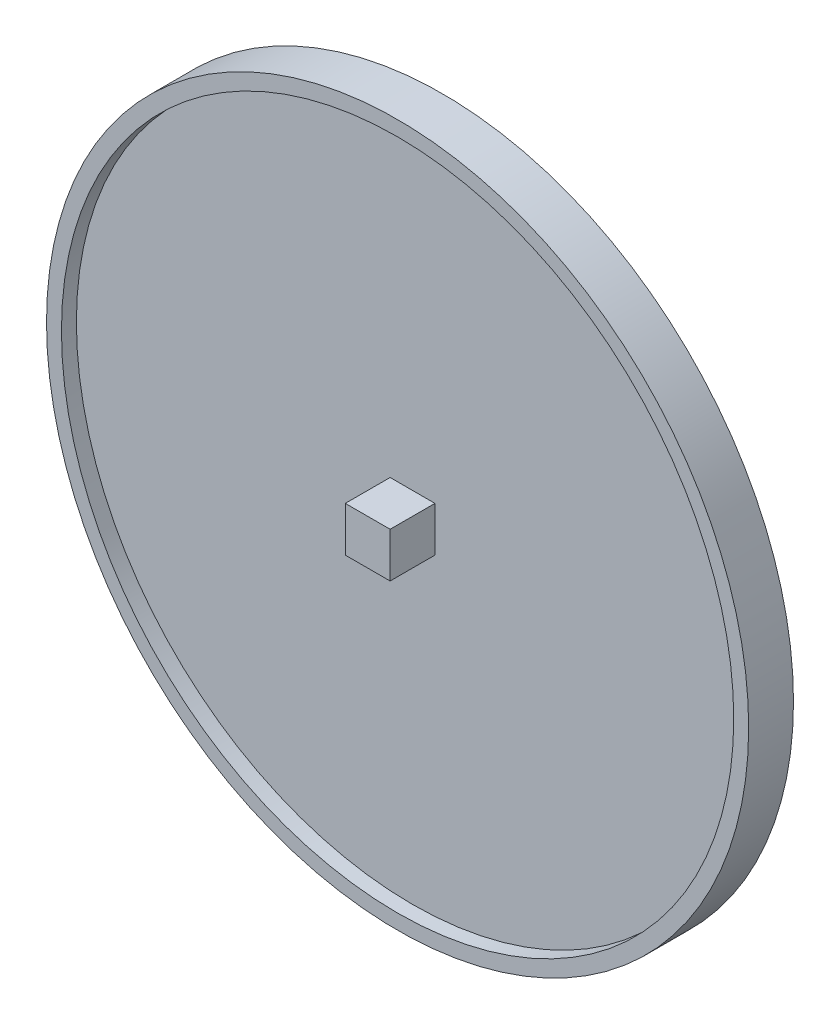
ISO-10303-21;
HEADER;
FILE_DESCRIPTION(('STEP AP214'),'2;1');
FILE_NAME('part.step','',(''),(''),'','','');
FILE_SCHEMA(('AUTOMOTIVE_DESIGN { 1 0 10303 214 1 1 1 1 }'));
ENDSEC;
DATA;
#1=APPLICATION_CONTEXT('core data for automotive mechanical design processes');
#2=APPLICATION_PROTOCOL_DEFINITION('international standard','automotive_design',2000,#1);
#3=PRODUCT_CONTEXT('',#1,'mechanical');
#4=PRODUCT('Part','Part','',(#3));
#5=PRODUCT_RELATED_PRODUCT_CATEGORY('part','',(#4));
#6=PRODUCT_DEFINITION_FORMATION('','',#4);
#7=PRODUCT_DEFINITION_CONTEXT('part definition',#1,'design');
#8=PRODUCT_DEFINITION('design','',#6,#7);
#9=PRODUCT_DEFINITION_SHAPE('','',#8);
#10=(LENGTH_UNIT() NAMED_UNIT(*) SI_UNIT(.MILLI.,.METRE.));
#11=(NAMED_UNIT(*) PLANE_ANGLE_UNIT() SI_UNIT($,.RADIAN.));
#12=(NAMED_UNIT(*) SI_UNIT($,.STERADIAN.) SOLID_ANGLE_UNIT());
#13=UNCERTAINTY_MEASURE_WITH_UNIT(LENGTH_MEASURE(1.E-05),#10,'distance_accuracy_value','');
#14=(GEOMETRIC_REPRESENTATION_CONTEXT(3) GLOBAL_UNCERTAINTY_ASSIGNED_CONTEXT((#13)) GLOBAL_UNIT_ASSIGNED_CONTEXT((#10,
#11,#12)) REPRESENTATION_CONTEXT('',''));
#15=CARTESIAN_POINT('',(0.,0.,0.));
#16=DIRECTION('',(0.,0.,1.));
#17=DIRECTION('',(1.,0.,0.));
#18=AXIS2_PLACEMENT_3D('',#15,#16,#17);
#19=CARTESIAN_POINT('',(0.,0.,20.));
#20=DIRECTION('',(0.,0.,1.));
#21=DIRECTION('',(1.,0.,0.));
#22=AXIS2_PLACEMENT_3D('',#19,#20,#21);
#23=PLANE('',#22);
#24=CARTESIAN_POINT('',(0.,0.,20.));
#25=DIRECTION('',(0.,0.,1.));
#26=DIRECTION('',(1.,0.,0.));
#27=AXIS2_PLACEMENT_3D('',#24,#25,#26);
#28=CIRCLE('',#27,225.);
#29=CARTESIAN_POINT('',(225.,0.,20.));
#30=VERTEX_POINT('',#29);
#31=EDGE_CURVE('E11',#30,#30,#28,.F.);
#32=ORIENTED_EDGE('',*,*,#31,.F.);
#33=EDGE_LOOP('',(#32));
#34=FACE_BOUND('',#33,.T.);
#35=DIRECTION('',(1.,0.,0.));
#36=VECTOR('',#35,1.);
#37=CARTESIAN_POINT('',(15.,-15.,20.));
#38=LINE('',#37,#36);
#39=CARTESIAN_POINT('',(-15.,-15.,20.));
#40=VERTEX_POINT('',#39);
#41=CARTESIAN_POINT('',(15.,-15.,20.));
#42=VERTEX_POINT('',#41);
#43=EDGE_CURVE('E97',#40,#42,#38,.T.);
#44=ORIENTED_EDGE('',*,*,#43,.F.);
#45=DIRECTION('',(0.,-1.,0.));
#46=VECTOR('',#45,1.);
#47=CARTESIAN_POINT('',(-15.,-15.,20.));
#48=LINE('',#47,#46);
#49=CARTESIAN_POINT('',(-15.,15.,20.));
#50=VERTEX_POINT('',#49);
#51=EDGE_CURVE('E111',#50,#40,#48,.T.);
#52=ORIENTED_EDGE('',*,*,#51,.F.);
#53=DIRECTION('',(-1.,0.,0.));
#54=VECTOR('',#53,1.);
#55=CARTESIAN_POINT('',(15.,15.,20.));
#56=LINE('',#55,#54);
#57=CARTESIAN_POINT('',(15.,15.,20.));
#58=VERTEX_POINT('',#57);
#59=EDGE_CURVE('E77',#58,#50,#56,.T.);
#60=ORIENTED_EDGE('',*,*,#59,.F.);
#61=DIRECTION('',(0.,1.,0.));
#62=VECTOR('',#61,1.);
#63=CARTESIAN_POINT('',(15.,-15.,20.));
#64=LINE('',#63,#62);
#65=EDGE_CURVE('E117',#42,#58,#64,.T.);
#66=ORIENTED_EDGE('',*,*,#65,.F.);
#67=EDGE_LOOP('',(#44,#52,#60,#66));
#68=FACE_BOUND('',#67,.T.);
#69=ADVANCED_FACE('F39',(#34,#68),#23,.T.);
#70=CARTESIAN_POINT('',(0.,0.,20.));
#71=DIRECTION('',(0.,0.,-1.));
#72=DIRECTION('',(-1.,0.,0.));
#73=AXIS2_PLACEMENT_3D('',#70,#71,#72);
#74=CYLINDRICAL_SURFACE('',#73,235.);
#75=CARTESIAN_POINT('',(0.,0.,0.));
#76=DIRECTION('',(0.,0.,1.));
#77=DIRECTION('',(1.,0.,0.));
#78=AXIS2_PLACEMENT_3D('',#75,#76,#77);
#79=CIRCLE('',#78,235.);
#80=CARTESIAN_POINT('',(235.,0.,0.));
#81=VERTEX_POINT('',#80);
#82=EDGE_CURVE('E48',#81,#81,#79,.T.);
#83=ORIENTED_EDGE('',*,*,#82,.T.);
#84=EDGE_LOOP('',(#83));
#85=FACE_BOUND('',#84,.T.);
#86=CARTESIAN_POINT('',(0.,0.,30.));
#87=DIRECTION('',(0.,0.,1.));
#88=DIRECTION('',(1.,0.,0.));
#89=AXIS2_PLACEMENT_3D('',#86,#87,#88);
#90=CIRCLE('',#89,235.);
#91=CARTESIAN_POINT('',(235.,0.,30.));
#92=VERTEX_POINT('',#91);
#93=EDGE_CURVE('E132',#92,#92,#90,.T.);
#94=ORIENTED_EDGE('',*,*,#93,.F.);
#95=EDGE_LOOP('',(#94));
#96=FACE_BOUND('',#95,.T.);
#97=ADVANCED_FACE('F41',(#85,#96),#74,.T.);
#98=CARTESIAN_POINT('',(0.,0.,0.));
#99=DIRECTION('',(0.,0.,1.));
#100=DIRECTION('',(1.,0.,0.));
#101=AXIS2_PLACEMENT_3D('',#98,#99,#100);
#102=PLANE('',#101);
#103=ORIENTED_EDGE('',*,*,#82,.F.);
#104=EDGE_LOOP('',(#103));
#105=FACE_BOUND('',#104,.T.);
#106=ADVANCED_FACE('F141',(#105),#102,.F.);
#107=CARTESIAN_POINT('',(0.,0.,30.));
#108=DIRECTION('',(0.,0.,1.));
#109=DIRECTION('',(1.,0.,0.));
#110=AXIS2_PLACEMENT_3D('',#107,#108,#109);
#111=PLANE('',#110);
#112=ORIENTED_EDGE('',*,*,#93,.T.);
#113=EDGE_LOOP('',(#112));
#114=FACE_BOUND('',#113,.T.);
#115=CARTESIAN_POINT('',(0.,0.,30.));
#116=DIRECTION('',(0.,0.,1.));
#117=DIRECTION('',(1.,0.,0.));
#118=AXIS2_PLACEMENT_3D('',#115,#116,#117);
#119=CIRCLE('',#118,225.);
#120=CARTESIAN_POINT('',(225.,0.,30.));
#121=VERTEX_POINT('',#120);
#122=EDGE_CURVE('E128',#121,#121,#119,.T.);
#123=ORIENTED_EDGE('',*,*,#122,.F.);
#124=EDGE_LOOP('',(#123));
#125=FACE_BOUND('',#124,.T.);
#126=ADVANCED_FACE('F143',(#114,#125),#111,.T.);
#127=CARTESIAN_POINT('',(0.,0.,30.));
#128=DIRECTION('',(0.,0.,-1.));
#129=DIRECTION('',(-1.,0.,0.));
#130=AXIS2_PLACEMENT_3D('',#127,#128,#129);
#131=CYLINDRICAL_SURFACE('',#130,225.);
#132=ORIENTED_EDGE('',*,*,#122,.T.);
#133=EDGE_LOOP('',(#132));
#134=FACE_BOUND('',#133,.T.);
#135=ORIENTED_EDGE('',*,*,#31,.T.);
#136=EDGE_LOOP('',(#135));
#137=FACE_BOUND('',#136,.T.);
#138=ADVANCED_FACE('F148',(#134,#137),#131,.F.);
#139=CARTESIAN_POINT('',(-15.,-15.,50.));
#140=DIRECTION('',(1.,0.,0.));
#141=DIRECTION('',(0.,0.,-1.));
#142=AXIS2_PLACEMENT_3D('',#139,#140,#141);
#143=PLANE('',#142);
#144=ORIENTED_EDGE('',*,*,#51,.T.);
#145=DIRECTION('',(0.,0.,-1.));
#146=VECTOR('',#145,1.);
#147=CARTESIAN_POINT('',(-15.,-15.,50.));
#148=LINE('',#147,#146);
#149=CARTESIAN_POINT('',(-15.,-15.,50.));
#150=VERTEX_POINT('',#149);
#151=EDGE_CURVE('E101',#150,#40,#148,.T.);
#152=ORIENTED_EDGE('',*,*,#151,.F.);
#153=DIRECTION('',(0.,-1.,0.));
#154=VECTOR('',#153,1.);
#155=CARTESIAN_POINT('',(-15.,-15.,50.));
#156=LINE('',#155,#154);
#157=CARTESIAN_POINT('',(-15.,15.,50.));
#158=VERTEX_POINT('',#157);
#159=EDGE_CURVE('E89',#158,#150,#156,.T.);
#160=ORIENTED_EDGE('',*,*,#159,.F.);
#161=DIRECTION('',(0.,0.,-1.));
#162=VECTOR('',#161,1.);
#163=CARTESIAN_POINT('',(-15.,15.,50.));
#164=LINE('',#163,#162);
#165=EDGE_CURVE('E107',#158,#50,#164,.T.);
#166=ORIENTED_EDGE('',*,*,#165,.T.);
#167=EDGE_LOOP('',(#144,#152,#160,#166));
#168=FACE_BOUND('',#167,.T.);
#169=ADVANCED_FACE('F161',(#168),#143,.F.);
#170=CARTESIAN_POINT('',(15.,-15.,50.));
#171=DIRECTION('',(0.,1.,0.));
#172=DIRECTION('',(-1.,0.,0.));
#173=AXIS2_PLACEMENT_3D('',#170,#171,#172);
#174=PLANE('',#173);
#175=ORIENTED_EDGE('',*,*,#43,.T.);
#176=DIRECTION('',(0.,0.,-1.));
#177=VECTOR('',#176,1.);
#178=CARTESIAN_POINT('',(15.,-15.,50.));
#179=LINE('',#178,#177);
#180=CARTESIAN_POINT('',(15.,-15.,50.));
#181=VERTEX_POINT('',#180);
#182=EDGE_CURVE('E94',#181,#42,#179,.T.);
#183=ORIENTED_EDGE('',*,*,#182,.F.);
#184=DIRECTION('',(1.,0.,0.));
#185=VECTOR('',#184,1.);
#186=CARTESIAN_POINT('',(15.,-15.,50.));
#187=LINE('',#186,#185);
#188=EDGE_CURVE('E84',#150,#181,#187,.T.);
#189=ORIENTED_EDGE('',*,*,#188,.F.);
#190=ORIENTED_EDGE('',*,*,#151,.T.);
#191=EDGE_LOOP('',(#175,#183,#189,#190));
#192=FACE_BOUND('',#191,.T.);
#193=ADVANCED_FACE('F95',(#192),#174,.F.);
#194=CARTESIAN_POINT('',(15.,-15.,50.));
#195=DIRECTION('',(-1.,0.,0.));
#196=DIRECTION('',(0.,0.,1.));
#197=AXIS2_PLACEMENT_3D('',#194,#195,#196);
#198=PLANE('',#197);
#199=ORIENTED_EDGE('',*,*,#65,.T.);
#200=DIRECTION('',(0.,0.,-1.));
#201=VECTOR('',#200,1.);
#202=CARTESIAN_POINT('',(15.,15.,50.));
#203=LINE('',#202,#201);
#204=CARTESIAN_POINT('',(15.,15.,50.));
#205=VERTEX_POINT('',#204);
#206=EDGE_CURVE('E55',#205,#58,#203,.T.);
#207=ORIENTED_EDGE('',*,*,#206,.F.);
#208=DIRECTION('',(0.,1.,0.));
#209=VECTOR('',#208,1.);
#210=CARTESIAN_POINT('',(15.,-15.,50.));
#211=LINE('',#210,#209);
#212=EDGE_CURVE('E87',#181,#205,#211,.T.);
#213=ORIENTED_EDGE('',*,*,#212,.F.);
#214=ORIENTED_EDGE('',*,*,#182,.T.);
#215=EDGE_LOOP('',(#199,#207,#213,#214));
#216=FACE_BOUND('',#215,.T.);
#217=ADVANCED_FACE('F103',(#216),#198,.F.);
#218=CARTESIAN_POINT('',(15.,15.,50.));
#219=DIRECTION('',(0.,-1.,0.));
#220=DIRECTION('',(1.,0.,0.));
#221=AXIS2_PLACEMENT_3D('',#218,#219,#220);
#222=PLANE('',#221);
#223=ORIENTED_EDGE('',*,*,#59,.T.);
#224=ORIENTED_EDGE('',*,*,#165,.F.);
#225=DIRECTION('',(-1.,0.,0.));
#226=VECTOR('',#225,1.);
#227=CARTESIAN_POINT('',(15.,15.,50.));
#228=LINE('',#227,#226);
#229=EDGE_CURVE('E63',#205,#158,#228,.T.);
#230=ORIENTED_EDGE('',*,*,#229,.F.);
#231=ORIENTED_EDGE('',*,*,#206,.T.);
#232=EDGE_LOOP('',(#223,#224,#230,#231));
#233=FACE_BOUND('',#232,.T.);
#234=ADVANCED_FACE('F170',(#233),#222,.F.);
#235=CARTESIAN_POINT('',(0.,0.,50.));
#236=DIRECTION('',(0.,0.,1.));
#237=DIRECTION('',(1.,0.,0.));
#238=AXIS2_PLACEMENT_3D('',#235,#236,#237);
#239=PLANE('',#238);
#240=ORIENTED_EDGE('',*,*,#159,.T.);
#241=ORIENTED_EDGE('',*,*,#188,.T.);
#242=ORIENTED_EDGE('',*,*,#212,.T.);
#243=ORIENTED_EDGE('',*,*,#229,.T.);
#244=EDGE_LOOP('',(#240,#241,#242,#243));
#245=FACE_BOUND('',#244,.T.);
#246=ADVANCED_FACE('F85',(#245),#239,.T.);
#247=CLOSED_SHELL('',(#69,#97,#106,#126,#138,#169,#193,#217,#234,#246));
#248=MANIFOLD_SOLID_BREP('B2',#247);
#249=ADVANCED_BREP_SHAPE_REPRESENTATION('',(#18,#248),#14);
#250=SHAPE_DEFINITION_REPRESENTATION(#9,#249);
ENDSEC;
END-ISO-10303-21;
